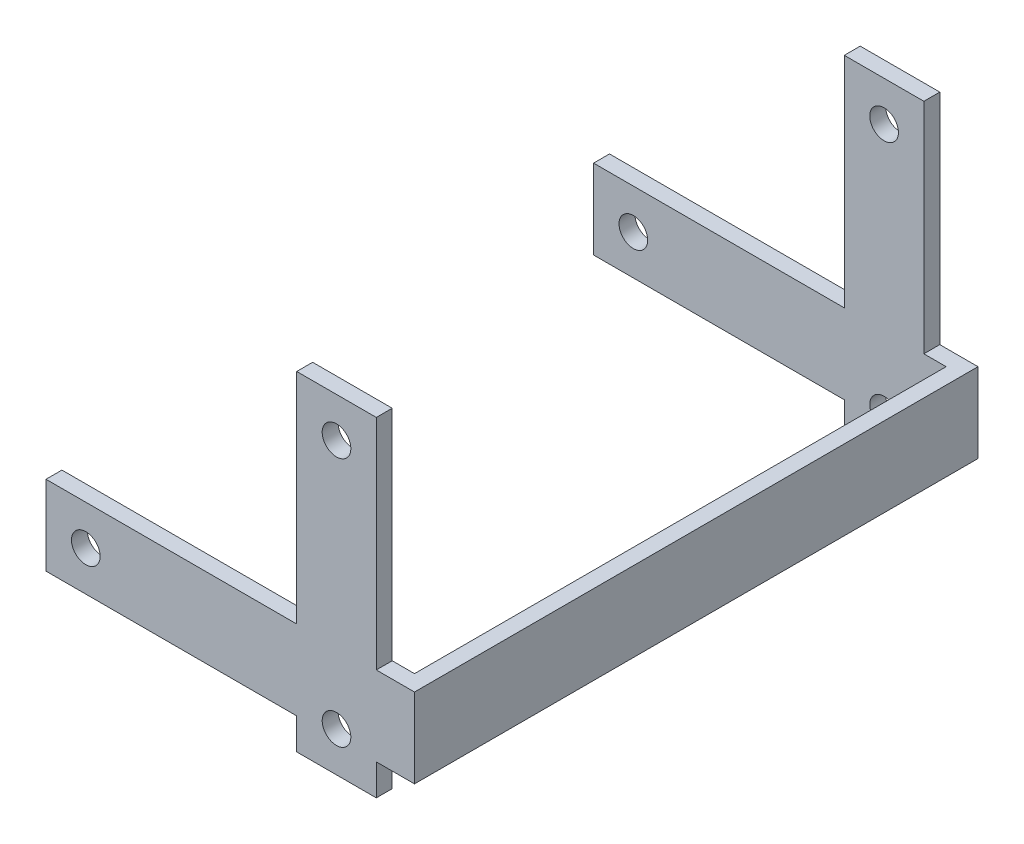
ISO-10303-21;
HEADER;
FILE_DESCRIPTION(('STEP AP214'),'2;1');
FILE_NAME('part.step','',(''),(''),'','','');
FILE_SCHEMA(('AUTOMOTIVE_DESIGN { 1 0 10303 214 1 1 1 1 }'));
ENDSEC;
DATA;
#1=APPLICATION_CONTEXT('core data for automotive mechanical design processes');
#2=APPLICATION_PROTOCOL_DEFINITION('international standard','automotive_design',2000,#1);
#3=PRODUCT_CONTEXT('',#1,'mechanical');
#4=PRODUCT('Part','Part','',(#3));
#5=PRODUCT_RELATED_PRODUCT_CATEGORY('part','',(#4));
#6=PRODUCT_DEFINITION_FORMATION('','',#4);
#7=PRODUCT_DEFINITION_CONTEXT('part definition',#1,'design');
#8=PRODUCT_DEFINITION('design','',#6,#7);
#9=PRODUCT_DEFINITION_SHAPE('','',#8);
#10=(LENGTH_UNIT() NAMED_UNIT(*) SI_UNIT(.MILLI.,.METRE.));
#11=(NAMED_UNIT(*) PLANE_ANGLE_UNIT() SI_UNIT($,.RADIAN.));
#12=(NAMED_UNIT(*) SI_UNIT($,.STERADIAN.) SOLID_ANGLE_UNIT());
#13=UNCERTAINTY_MEASURE_WITH_UNIT(LENGTH_MEASURE(1.E-05),#10,'distance_accuracy_value','');
#14=(GEOMETRIC_REPRESENTATION_CONTEXT(3) GLOBAL_UNCERTAINTY_ASSIGNED_CONTEXT((#13)) GLOBAL_UNIT_ASSIGNED_CONTEXT((#10,
#11,#12)) REPRESENTATION_CONTEXT('',''));
#15=CARTESIAN_POINT('',(0.,0.,0.));
#16=DIRECTION('',(0.,0.,1.));
#17=DIRECTION('',(1.,0.,0.));
#18=AXIS2_PLACEMENT_3D('',#15,#16,#17);
#19=CARTESIAN_POINT('',(0.,0.,0.));
#20=DIRECTION('',(0.,0.,1.));
#21=DIRECTION('',(1.,0.,0.));
#22=AXIS2_PLACEMENT_3D('',#19,#20,#21);
#23=PLANE('',#22);
#24=CARTESIAN_POINT('',(-66.25,-12.5,0.));
#25=DIRECTION('',(0.,0.,1.));
#26=DIRECTION('',(1.,0.,0.));
#27=AXIS2_PLACEMENT_3D('',#24,#25,#26);
#28=CIRCLE('',#27,4.5);
#29=CARTESIAN_POINT('',(-61.75,-12.5,0.));
#30=VERTEX_POINT('',#29);
#31=EDGE_CURVE('E265',#30,#30,#28,.T.);
#32=ORIENTED_EDGE('',*,*,#31,.T.);
#33=EDGE_LOOP('',(#32));
#34=FACE_BOUND('',#33,.T.);
#35=CARTESIAN_POINT('',(12.5,56.2,0.));
#36=DIRECTION('',(0.,0.,1.));
#37=DIRECTION('',(1.,0.,0.));
#38=AXIS2_PLACEMENT_3D('',#35,#36,#37);
#39=CIRCLE('',#38,4.50000000000001);
#40=CARTESIAN_POINT('',(17.,56.2,0.));
#41=VERTEX_POINT('',#40);
#42=EDGE_CURVE('E259',#41,#41,#39,.T.);
#43=ORIENTED_EDGE('',*,*,#42,.T.);
#44=EDGE_LOOP('',(#43));
#45=FACE_BOUND('',#44,.T.);
#46=CARTESIAN_POINT('',(12.5,-22.3,0.));
#47=DIRECTION('',(0.,0.,1.));
#48=DIRECTION('',(1.,0.,0.));
#49=AXIS2_PLACEMENT_3D('',#46,#47,#48);
#50=CIRCLE('',#49,4.5);
#51=CARTESIAN_POINT('',(17.,-22.3,0.));
#52=VERTEX_POINT('',#51);
#53=EDGE_CURVE('E253',#52,#52,#50,.T.);
#54=ORIENTED_EDGE('',*,*,#53,.T.);
#55=EDGE_LOOP('',(#54));
#56=FACE_BOUND('',#55,.T.);
#57=DIRECTION('',(0.,1.,0.));
#58=VECTOR('',#57,1.);
#59=CARTESIAN_POINT('',(32.,0.,0.));
#60=LINE('',#59,#58);
#61=CARTESIAN_POINT('',(32.,-25.,0.));
#62=VERTEX_POINT('',#61);
#63=CARTESIAN_POINT('',(32.,0.,0.));
#64=VERTEX_POINT('',#63);
#65=EDGE_CURVE('E51',#62,#64,#60,.T.);
#66=ORIENTED_EDGE('',*,*,#65,.F.);
#67=DIRECTION('',(1.,0.,0.));
#68=VECTOR('',#67,1.);
#69=CARTESIAN_POINT('',(25.,-25.,0.));
#70=LINE('',#69,#68);
#71=CARTESIAN_POINT('',(25.,-25.,0.));
#72=VERTEX_POINT('',#71);
#73=EDGE_CURVE('E175',#72,#62,#70,.T.);
#74=ORIENTED_EDGE('',*,*,#73,.F.);
#75=DIRECTION('',(0.,1.,0.));
#76=VECTOR('',#75,1.);
#77=CARTESIAN_POINT('',(25.,-34.8,0.));
#78=LINE('',#77,#76);
#79=CARTESIAN_POINT('',(25.,-34.8,0.));
#80=VERTEX_POINT('',#79);
#81=EDGE_CURVE('E173',#80,#72,#78,.T.);
#82=ORIENTED_EDGE('',*,*,#81,.F.);
#83=DIRECTION('',(1.,0.,0.));
#84=VECTOR('',#83,1.);
#85=CARTESIAN_POINT('',(0.,-34.8,0.));
#86=LINE('',#85,#84);
#87=CARTESIAN_POINT('',(0.,-34.8,0.));
#88=VERTEX_POINT('',#87);
#89=EDGE_CURVE('E171',#88,#80,#86,.T.);
#90=ORIENTED_EDGE('',*,*,#89,.F.);
#91=DIRECTION('',(0.,-1.,0.));
#92=VECTOR('',#91,1.);
#93=CARTESIAN_POINT('',(0.,-25.,0.));
#94=LINE('',#93,#92);
#95=CARTESIAN_POINT('',(0.,-25.,0.));
#96=VERTEX_POINT('',#95);
#97=EDGE_CURVE('E169',#96,#88,#94,.T.);
#98=ORIENTED_EDGE('',*,*,#97,.F.);
#99=DIRECTION('',(1.,0.,0.));
#100=VECTOR('',#99,1.);
#101=CARTESIAN_POINT('',(-78.75,-25.,0.));
#102=LINE('',#101,#100);
#103=CARTESIAN_POINT('',(-78.75,-25.,0.));
#104=VERTEX_POINT('',#103);
#105=EDGE_CURVE('E166',#104,#96,#102,.T.);
#106=ORIENTED_EDGE('',*,*,#105,.F.);
#107=DIRECTION('',(0.,-1.,0.));
#108=VECTOR('',#107,1.);
#109=CARTESIAN_POINT('',(-78.75,0.,0.));
#110=LINE('',#109,#108);
#111=CARTESIAN_POINT('',(-78.75,0.,0.));
#112=VERTEX_POINT('',#111);
#113=EDGE_CURVE('E163',#112,#104,#110,.T.);
#114=ORIENTED_EDGE('',*,*,#113,.F.);
#115=DIRECTION('',(-1.,0.,0.));
#116=VECTOR('',#115,1.);
#117=CARTESIAN_POINT('',(0.,0.,0.));
#118=LINE('',#117,#116);
#119=CARTESIAN_POINT('',(0.,0.,0.));
#120=VERTEX_POINT('',#119);
#121=EDGE_CURVE('E99',#120,#112,#118,.T.);
#122=ORIENTED_EDGE('',*,*,#121,.F.);
#123=DIRECTION('',(0.,-1.,0.));
#124=VECTOR('',#123,1.);
#125=CARTESIAN_POINT('',(0.,68.7,0.));
#126=LINE('',#125,#124);
#127=CARTESIAN_POINT('',(0.,68.7,0.));
#128=VERTEX_POINT('',#127);
#129=EDGE_CURVE('E182',#128,#120,#126,.T.);
#130=ORIENTED_EDGE('',*,*,#129,.F.);
#131=DIRECTION('',(-1.,0.,0.));
#132=VECTOR('',#131,1.);
#133=CARTESIAN_POINT('',(25.,68.7,0.));
#134=LINE('',#133,#132);
#135=CARTESIAN_POINT('',(25.,68.7,0.));
#136=VERTEX_POINT('',#135);
#137=EDGE_CURVE('E151',#136,#128,#134,.T.);
#138=ORIENTED_EDGE('',*,*,#137,.F.);
#139=DIRECTION('',(0.,1.,0.));
#140=VECTOR('',#139,1.);
#141=CARTESIAN_POINT('',(25.,0.,0.));
#142=LINE('',#141,#140);
#143=CARTESIAN_POINT('',(25.,0.,0.));
#144=VERTEX_POINT('',#143);
#145=EDGE_CURVE('E179',#144,#136,#142,.T.);
#146=ORIENTED_EDGE('',*,*,#145,.F.);
#147=DIRECTION('',(-1.,0.,0.));
#148=VECTOR('',#147,1.);
#149=CARTESIAN_POINT('',(37.,0.,0.));
#150=LINE('',#149,#148);
#151=EDGE_CURVE('E177',#64,#144,#150,.T.);
#152=ORIENTED_EDGE('',*,*,#151,.F.);
#153=EDGE_LOOP('',(#66,#74,#82,#90,#98,#106,#114,#122,#130,#138,#146,#152));
#154=FACE_BOUND('',#153,.T.);
#155=ADVANCED_FACE('F36',(#34,#45,#56,#154),#23,.F.);
#156=CARTESIAN_POINT('',(0.,0.,5.));
#157=DIRECTION('',(0.,0.,1.));
#158=DIRECTION('',(1.,0.,0.));
#159=AXIS2_PLACEMENT_3D('',#156,#157,#158);
#160=PLANE('',#159);
#161=CARTESIAN_POINT('',(12.5,56.2,5.));
#162=DIRECTION('',(0.,0.,1.));
#163=DIRECTION('',(1.,0.,0.));
#164=AXIS2_PLACEMENT_3D('',#161,#162,#163);
#165=CIRCLE('',#164,4.50000000000001);
#166=CARTESIAN_POINT('',(17.,56.2,5.));
#167=VERTEX_POINT('',#166);
#168=EDGE_CURVE('E256',#167,#167,#165,.T.);
#169=ORIENTED_EDGE('',*,*,#168,.F.);
#170=EDGE_LOOP('',(#169));
#171=FACE_BOUND('',#170,.T.);
#172=DIRECTION('',(0.,-1.,0.));
#173=VECTOR('',#172,1.);
#174=CARTESIAN_POINT('',(-78.75,0.,5.));
#175=LINE('',#174,#173);
#176=CARTESIAN_POINT('',(-78.75,0.,5.));
#177=VERTEX_POINT('',#176);
#178=CARTESIAN_POINT('',(-78.75,-25.,5.));
#179=VERTEX_POINT('',#178);
#180=EDGE_CURVE('E185',#177,#179,#175,.T.);
#181=ORIENTED_EDGE('',*,*,#180,.T.);
#182=DIRECTION('',(1.,0.,0.));
#183=VECTOR('',#182,1.);
#184=CARTESIAN_POINT('',(-78.75,-25.,5.));
#185=LINE('',#184,#183);
#186=CARTESIAN_POINT('',(0.,-25.,5.));
#187=VERTEX_POINT('',#186);
#188=EDGE_CURVE('E107',#179,#187,#185,.T.);
#189=ORIENTED_EDGE('',*,*,#188,.T.);
#190=DIRECTION('',(0.,-1.,0.));
#191=VECTOR('',#190,1.);
#192=CARTESIAN_POINT('',(0.,-25.,5.));
#193=LINE('',#192,#191);
#194=CARTESIAN_POINT('',(0.,-34.8,5.));
#195=VERTEX_POINT('',#194);
#196=EDGE_CURVE('E212',#187,#195,#193,.T.);
#197=ORIENTED_EDGE('',*,*,#196,.T.);
#198=DIRECTION('',(1.,0.,0.));
#199=VECTOR('',#198,1.);
#200=CARTESIAN_POINT('',(0.,-34.8,5.));
#201=LINE('',#200,#199);
#202=CARTESIAN_POINT('',(25.,-34.8,5.));
#203=VERTEX_POINT('',#202);
#204=EDGE_CURVE('E227',#195,#203,#201,.T.);
#205=ORIENTED_EDGE('',*,*,#204,.T.);
#206=DIRECTION('',(0.,1.,0.));
#207=VECTOR('',#206,1.);
#208=CARTESIAN_POINT('',(25.,-34.8,5.));
#209=LINE('',#208,#207);
#210=CARTESIAN_POINT('',(25.,-25.,5.));
#211=VERTEX_POINT('',#210);
#212=EDGE_CURVE('E224',#203,#211,#209,.T.);
#213=ORIENTED_EDGE('',*,*,#212,.T.);
#214=DIRECTION('',(1.,0.,0.));
#215=VECTOR('',#214,1.);
#216=CARTESIAN_POINT('',(25.,-25.,5.));
#217=LINE('',#216,#215);
#218=CARTESIAN_POINT('',(37.,-25.,5.));
#219=VERTEX_POINT('',#218);
#220=EDGE_CURVE('E226',#211,#219,#217,.T.);
#221=ORIENTED_EDGE('',*,*,#220,.T.);
#222=DIRECTION('',(0.,1.,0.));
#223=VECTOR('',#222,1.);
#224=CARTESIAN_POINT('',(37.,-25.,5.));
#225=LINE('',#224,#223);
#226=CARTESIAN_POINT('',(37.,0.,5.));
#227=VERTEX_POINT('',#226);
#228=EDGE_CURVE('E229',#219,#227,#225,.T.);
#229=ORIENTED_EDGE('',*,*,#228,.T.);
#230=DIRECTION('',(-1.,0.,0.));
#231=VECTOR('',#230,1.);
#232=CARTESIAN_POINT('',(37.,0.,5.));
#233=LINE('',#232,#231);
#234=CARTESIAN_POINT('',(25.,0.,5.));
#235=VERTEX_POINT('',#234);
#236=EDGE_CURVE('E235',#227,#235,#233,.T.);
#237=ORIENTED_EDGE('',*,*,#236,.T.);
#238=DIRECTION('',(0.,1.,0.));
#239=VECTOR('',#238,1.);
#240=CARTESIAN_POINT('',(25.,0.,5.));
#241=LINE('',#240,#239);
#242=CARTESIAN_POINT('',(25.,68.7,5.));
#243=VERTEX_POINT('',#242);
#244=EDGE_CURVE('E142',#235,#243,#241,.T.);
#245=ORIENTED_EDGE('',*,*,#244,.T.);
#246=DIRECTION('',(-1.,0.,0.));
#247=VECTOR('',#246,1.);
#248=CARTESIAN_POINT('',(25.,68.7,5.));
#249=LINE('',#248,#247);
#250=CARTESIAN_POINT('',(0.,68.7,5.));
#251=VERTEX_POINT('',#250);
#252=EDGE_CURVE('E134',#243,#251,#249,.T.);
#253=ORIENTED_EDGE('',*,*,#252,.T.);
#254=DIRECTION('',(0.,-1.,0.));
#255=VECTOR('',#254,1.);
#256=CARTESIAN_POINT('',(0.,68.7,5.));
#257=LINE('',#256,#255);
#258=CARTESIAN_POINT('',(0.,0.,5.));
#259=VERTEX_POINT('',#258);
#260=EDGE_CURVE('E139',#251,#259,#257,.T.);
#261=ORIENTED_EDGE('',*,*,#260,.T.);
#262=DIRECTION('',(-1.,0.,0.));
#263=VECTOR('',#262,1.);
#264=CARTESIAN_POINT('',(0.,0.,5.));
#265=LINE('',#264,#263);
#266=EDGE_CURVE('E60',#259,#177,#265,.T.);
#267=ORIENTED_EDGE('',*,*,#266,.T.);
#268=EDGE_LOOP('',(#181,#189,#197,#205,#213,#221,#229,#237,#245,#253,#261,#267));
#269=FACE_BOUND('',#268,.T.);
#270=CARTESIAN_POINT('',(12.5,-22.3,5.));
#271=DIRECTION('',(0.,0.,1.));
#272=DIRECTION('',(1.,0.,0.));
#273=AXIS2_PLACEMENT_3D('',#270,#271,#272);
#274=CIRCLE('',#273,4.5);
#275=CARTESIAN_POINT('',(17.,-22.3,5.));
#276=VERTEX_POINT('',#275);
#277=EDGE_CURVE('E167',#276,#276,#274,.T.);
#278=ORIENTED_EDGE('',*,*,#277,.F.);
#279=EDGE_LOOP('',(#278));
#280=FACE_BOUND('',#279,.T.);
#281=CARTESIAN_POINT('',(-66.25,-12.5,5.));
#282=DIRECTION('',(0.,0.,1.));
#283=DIRECTION('',(1.,0.,0.));
#284=AXIS2_PLACEMENT_3D('',#281,#282,#283);
#285=CIRCLE('',#284,4.5);
#286=CARTESIAN_POINT('',(-61.75,-12.5,5.));
#287=VERTEX_POINT('',#286);
#288=EDGE_CURVE('E262',#287,#287,#285,.T.);
#289=ORIENTED_EDGE('',*,*,#288,.F.);
#290=EDGE_LOOP('',(#289));
#291=FACE_BOUND('',#290,.T.);
#292=ADVANCED_FACE('F136',(#171,#269,#280,#291),#160,.T.);
#293=CARTESIAN_POINT('',(-78.75,0.,5.));
#294=DIRECTION('',(1.,0.,0.));
#295=DIRECTION('',(0.,0.,-1.));
#296=AXIS2_PLACEMENT_3D('',#293,#294,#295);
#297=PLANE('',#296);
#298=ORIENTED_EDGE('',*,*,#113,.T.);
#299=DIRECTION('',(0.,0.,-1.));
#300=VECTOR('',#299,1.);
#301=CARTESIAN_POINT('',(-78.75,-25.,5.));
#302=LINE('',#301,#300);
#303=EDGE_CURVE('E11',#179,#104,#302,.T.);
#304=ORIENTED_EDGE('',*,*,#303,.F.);
#305=ORIENTED_EDGE('',*,*,#180,.F.);
#306=DIRECTION('',(0.,0.,-1.));
#307=VECTOR('',#306,1.);
#308=CARTESIAN_POINT('',(-78.75,0.,5.));
#309=LINE('',#308,#307);
#310=EDGE_CURVE('E159',#177,#112,#309,.T.);
#311=ORIENTED_EDGE('',*,*,#310,.T.);
#312=EDGE_LOOP('',(#298,#304,#305,#311));
#313=FACE_BOUND('',#312,.T.);
#314=ADVANCED_FACE('F38',(#313),#297,.F.);
#315=CARTESIAN_POINT('',(-78.75,-25.,5.));
#316=DIRECTION('',(0.,1.,0.));
#317=DIRECTION('',(0.,0.,1.));
#318=AXIS2_PLACEMENT_3D('',#315,#316,#317);
#319=PLANE('',#318);
#320=ORIENTED_EDGE('',*,*,#105,.T.);
#321=DIRECTION('',(0.,0.,-1.));
#322=VECTOR('',#321,1.);
#323=CARTESIAN_POINT('',(0.,-25.,5.));
#324=LINE('',#323,#322);
#325=EDGE_CURVE('E44',#187,#96,#324,.T.);
#326=ORIENTED_EDGE('',*,*,#325,.F.);
#327=ORIENTED_EDGE('',*,*,#188,.F.);
#328=ORIENTED_EDGE('',*,*,#303,.T.);
#329=EDGE_LOOP('',(#320,#326,#327,#328));
#330=FACE_BOUND('',#329,.T.);
#331=ADVANCED_FACE('F547',(#330),#319,.F.);
#332=CARTESIAN_POINT('',(0.,-25.,5.));
#333=DIRECTION('',(1.,0.,0.));
#334=DIRECTION('',(0.,1.,0.));
#335=AXIS2_PLACEMENT_3D('',#332,#333,#334);
#336=PLANE('',#335);
#337=ORIENTED_EDGE('',*,*,#97,.T.);
#338=DIRECTION('',(0.,0.,-1.));
#339=VECTOR('',#338,1.);
#340=CARTESIAN_POINT('',(0.,-34.8,5.));
#341=LINE('',#340,#339);
#342=EDGE_CURVE('E204',#195,#88,#341,.T.);
#343=ORIENTED_EDGE('',*,*,#342,.F.);
#344=ORIENTED_EDGE('',*,*,#196,.F.);
#345=ORIENTED_EDGE('',*,*,#325,.T.);
#346=EDGE_LOOP('',(#337,#343,#344,#345));
#347=FACE_BOUND('',#346,.T.);
#348=ADVANCED_FACE('F210',(#347),#336,.F.);
#349=CARTESIAN_POINT('',(0.,-34.8,5.));
#350=DIRECTION('',(0.,1.,0.));
#351=DIRECTION('',(0.,0.,1.));
#352=AXIS2_PLACEMENT_3D('',#349,#350,#351);
#353=PLANE('',#352);
#354=ORIENTED_EDGE('',*,*,#89,.T.);
#355=DIRECTION('',(0.,0.,-1.));
#356=VECTOR('',#355,1.);
#357=CARTESIAN_POINT('',(25.,-34.8,5.));
#358=LINE('',#357,#356);
#359=EDGE_CURVE('E201',#203,#80,#358,.T.);
#360=ORIENTED_EDGE('',*,*,#359,.F.);
#361=ORIENTED_EDGE('',*,*,#204,.F.);
#362=ORIENTED_EDGE('',*,*,#342,.T.);
#363=EDGE_LOOP('',(#354,#360,#361,#362));
#364=FACE_BOUND('',#363,.T.);
#365=ADVANCED_FACE('F218',(#364),#353,.F.);
#366=CARTESIAN_POINT('',(25.,-34.8,5.));
#367=DIRECTION('',(-1.,0.,0.));
#368=DIRECTION('',(0.,-1.,0.));
#369=AXIS2_PLACEMENT_3D('',#366,#367,#368);
#370=PLANE('',#369);
#371=ORIENTED_EDGE('',*,*,#81,.T.);
#372=DIRECTION('',(0.,0.,-1.));
#373=VECTOR('',#372,1.);
#374=CARTESIAN_POINT('',(25.,-25.,5.));
#375=LINE('',#374,#373);
#376=EDGE_CURVE('E198',#211,#72,#375,.T.);
#377=ORIENTED_EDGE('',*,*,#376,.F.);
#378=ORIENTED_EDGE('',*,*,#212,.F.);
#379=ORIENTED_EDGE('',*,*,#359,.T.);
#380=EDGE_LOOP('',(#371,#377,#378,#379));
#381=FACE_BOUND('',#380,.T.);
#382=ADVANCED_FACE('F222',(#381),#370,.F.);
#383=CARTESIAN_POINT('',(25.,-25.,5.));
#384=DIRECTION('',(0.,1.,0.));
#385=DIRECTION('',(0.,0.,1.));
#386=AXIS2_PLACEMENT_3D('',#383,#384,#385);
#387=PLANE('',#386);
#388=ORIENTED_EDGE('',*,*,#73,.T.);
#389=DIRECTION('',(0.,0.,1.));
#390=VECTOR('',#389,1.);
#391=CARTESIAN_POINT('',(32.,-25.,-83.5));
#392=LINE('',#391,#390);
#393=CARTESIAN_POINT('',(32.,-25.,-167.));
#394=VERTEX_POINT('',#393);
#395=EDGE_CURVE('E268',#394,#62,#392,.T.);
#396=ORIENTED_EDGE('',*,*,#395,.F.);
#397=DIRECTION('',(1.,0.,0.));
#398=VECTOR('',#397,1.);
#399=CARTESIAN_POINT('',(25.,-25.,-167.));
#400=LINE('',#399,#398);
#401=CARTESIAN_POINT('',(25.,-25.,-167.));
#402=VERTEX_POINT('',#401);
#403=EDGE_CURVE('E323',#402,#394,#400,.T.);
#404=ORIENTED_EDGE('',*,*,#403,.F.);
#405=DIRECTION('',(0.,0.,1.));
#406=VECTOR('',#405,1.);
#407=CARTESIAN_POINT('',(25.,-25.,-172.));
#408=LINE('',#407,#406);
#409=CARTESIAN_POINT('',(25.,-25.,-172.));
#410=VERTEX_POINT('',#409);
#411=EDGE_CURVE('E288',#410,#402,#408,.T.);
#412=ORIENTED_EDGE('',*,*,#411,.F.);
#413=DIRECTION('',(1.,0.,0.));
#414=VECTOR('',#413,1.);
#415=CARTESIAN_POINT('',(25.,-25.,-172.));
#416=LINE('',#415,#414);
#417=CARTESIAN_POINT('',(37.,-25.,-172.));
#418=VERTEX_POINT('',#417);
#419=EDGE_CURVE('E359',#410,#418,#416,.T.);
#420=ORIENTED_EDGE('',*,*,#419,.T.);
#421=DIRECTION('',(0.,0.,-1.));
#422=VECTOR('',#421,1.);
#423=CARTESIAN_POINT('',(37.,-25.,5.));
#424=LINE('',#423,#422);
#425=EDGE_CURVE('E195',#219,#418,#424,.T.);
#426=ORIENTED_EDGE('',*,*,#425,.F.);
#427=ORIENTED_EDGE('',*,*,#220,.F.);
#428=ORIENTED_EDGE('',*,*,#376,.T.);
#429=EDGE_LOOP('',(#388,#396,#404,#412,#420,#426,#427,#428));
#430=FACE_BOUND('',#429,.T.);
#431=ADVANCED_FACE('F497',(#430),#387,.F.);
#432=CARTESIAN_POINT('',(37.,-25.,5.));
#433=DIRECTION('',(-1.,0.,0.));
#434=DIRECTION('',(0.,-1.,0.));
#435=AXIS2_PLACEMENT_3D('',#432,#433,#434);
#436=PLANE('',#435);
#437=ORIENTED_EDGE('',*,*,#425,.T.);
#438=DIRECTION('',(0.,1.,0.));
#439=VECTOR('',#438,1.);
#440=CARTESIAN_POINT('',(37.,-25.,-172.));
#441=LINE('',#440,#439);
#442=CARTESIAN_POINT('',(37.,0.,-172.));
#443=VERTEX_POINT('',#442);
#444=EDGE_CURVE('E356',#418,#443,#441,.T.);
#445=ORIENTED_EDGE('',*,*,#444,.T.);
#446=DIRECTION('',(0.,0.,-1.));
#447=VECTOR('',#446,1.);
#448=CARTESIAN_POINT('',(37.,0.,5.));
#449=LINE('',#448,#447);
#450=EDGE_CURVE('E192',#227,#443,#449,.T.);
#451=ORIENTED_EDGE('',*,*,#450,.F.);
#452=ORIENTED_EDGE('',*,*,#228,.F.);
#453=EDGE_LOOP('',(#437,#445,#451,#452));
#454=FACE_BOUND('',#453,.T.);
#455=ADVANCED_FACE('F495',(#454),#436,.F.);
#456=CARTESIAN_POINT('',(37.,0.,5.));
#457=DIRECTION('',(0.,-1.,0.));
#458=DIRECTION('',(1.,0.,0.));
#459=AXIS2_PLACEMENT_3D('',#456,#457,#458);
#460=PLANE('',#459);
#461=ORIENTED_EDGE('',*,*,#450,.T.);
#462=DIRECTION('',(-1.,0.,0.));
#463=VECTOR('',#462,1.);
#464=CARTESIAN_POINT('',(37.,0.,-172.));
#465=LINE('',#464,#463);
#466=CARTESIAN_POINT('',(25.,0.,-172.));
#467=VERTEX_POINT('',#466);
#468=EDGE_CURVE('E353',#443,#467,#465,.T.);
#469=ORIENTED_EDGE('',*,*,#468,.T.);
#470=DIRECTION('',(0.,0.,1.));
#471=VECTOR('',#470,1.);
#472=CARTESIAN_POINT('',(25.,0.,-172.));
#473=LINE('',#472,#471);
#474=CARTESIAN_POINT('',(25.,0.,-167.));
#475=VERTEX_POINT('',#474);
#476=EDGE_CURVE('E291',#467,#475,#473,.T.);
#477=ORIENTED_EDGE('',*,*,#476,.T.);
#478=DIRECTION('',(-1.,0.,0.));
#479=VECTOR('',#478,1.);
#480=CARTESIAN_POINT('',(37.,0.,-167.));
#481=LINE('',#480,#479);
#482=CARTESIAN_POINT('',(32.,0.,-167.));
#483=VERTEX_POINT('',#482);
#484=EDGE_CURVE('E320',#483,#475,#481,.T.);
#485=ORIENTED_EDGE('',*,*,#484,.F.);
#486=DIRECTION('',(0.,0.,1.));
#487=VECTOR('',#486,1.);
#488=CARTESIAN_POINT('',(32.,0.,-83.5));
#489=LINE('',#488,#487);
#490=EDGE_CURVE('E273',#483,#64,#489,.T.);
#491=ORIENTED_EDGE('',*,*,#490,.T.);
#492=ORIENTED_EDGE('',*,*,#151,.T.);
#493=DIRECTION('',(0.,0.,-1.));
#494=VECTOR('',#493,1.);
#495=CARTESIAN_POINT('',(25.,0.,5.));
#496=LINE('',#495,#494);
#497=EDGE_CURVE('E189',#235,#144,#496,.T.);
#498=ORIENTED_EDGE('',*,*,#497,.F.);
#499=ORIENTED_EDGE('',*,*,#236,.F.);
#500=EDGE_LOOP('',(#461,#469,#477,#485,#491,#492,#498,#499));
#501=FACE_BOUND('',#500,.T.);
#502=ADVANCED_FACE('F241',(#501),#460,.F.);
#503=CARTESIAN_POINT('',(25.,0.,5.));
#504=DIRECTION('',(-1.,0.,0.));
#505=DIRECTION('',(0.,-1.,0.));
#506=AXIS2_PLACEMENT_3D('',#503,#504,#505);
#507=PLANE('',#506);
#508=ORIENTED_EDGE('',*,*,#145,.T.);
#509=DIRECTION('',(0.,0.,-1.));
#510=VECTOR('',#509,1.);
#511=CARTESIAN_POINT('',(25.,68.7,5.));
#512=LINE('',#511,#510);
#513=EDGE_CURVE('E154',#243,#136,#512,.T.);
#514=ORIENTED_EDGE('',*,*,#513,.F.);
#515=ORIENTED_EDGE('',*,*,#244,.F.);
#516=ORIENTED_EDGE('',*,*,#497,.T.);
#517=EDGE_LOOP('',(#508,#514,#515,#516));
#518=FACE_BOUND('',#517,.T.);
#519=ADVANCED_FACE('F245',(#518),#507,.F.);
#520=CARTESIAN_POINT('',(25.,68.7,5.));
#521=DIRECTION('',(0.,-1.,0.));
#522=DIRECTION('',(1.,0.,0.));
#523=AXIS2_PLACEMENT_3D('',#520,#521,#522);
#524=PLANE('',#523);
#525=ORIENTED_EDGE('',*,*,#137,.T.);
#526=DIRECTION('',(0.,0.,-1.));
#527=VECTOR('',#526,1.);
#528=CARTESIAN_POINT('',(0.,68.7,5.));
#529=LINE('',#528,#527);
#530=EDGE_CURVE('E148',#251,#128,#529,.T.);
#531=ORIENTED_EDGE('',*,*,#530,.F.);
#532=ORIENTED_EDGE('',*,*,#252,.F.);
#533=ORIENTED_EDGE('',*,*,#513,.T.);
#534=EDGE_LOOP('',(#525,#531,#532,#533));
#535=FACE_BOUND('',#534,.T.);
#536=ADVANCED_FACE('F149',(#535),#524,.F.);
#537=CARTESIAN_POINT('',(0.,68.7,5.));
#538=DIRECTION('',(1.,0.,0.));
#539=DIRECTION('',(0.,1.,0.));
#540=AXIS2_PLACEMENT_3D('',#537,#538,#539);
#541=PLANE('',#540);
#542=ORIENTED_EDGE('',*,*,#129,.T.);
#543=DIRECTION('',(0.,0.,-1.));
#544=VECTOR('',#543,1.);
#545=CARTESIAN_POINT('',(0.,0.,5.));
#546=LINE('',#545,#544);
#547=EDGE_CURVE('E155',#259,#120,#546,.T.);
#548=ORIENTED_EDGE('',*,*,#547,.F.);
#549=ORIENTED_EDGE('',*,*,#260,.F.);
#550=ORIENTED_EDGE('',*,*,#530,.T.);
#551=EDGE_LOOP('',(#542,#548,#549,#550));
#552=FACE_BOUND('',#551,.T.);
#553=ADVANCED_FACE('F157',(#552),#541,.F.);
#554=CARTESIAN_POINT('',(0.,0.,5.));
#555=DIRECTION('',(0.,-1.,0.));
#556=DIRECTION('',(1.,0.,0.));
#557=AXIS2_PLACEMENT_3D('',#554,#555,#556);
#558=PLANE('',#557);
#559=ORIENTED_EDGE('',*,*,#121,.T.);
#560=ORIENTED_EDGE('',*,*,#310,.F.);
#561=ORIENTED_EDGE('',*,*,#266,.F.);
#562=ORIENTED_EDGE('',*,*,#547,.T.);
#563=EDGE_LOOP('',(#559,#560,#561,#562));
#564=FACE_BOUND('',#563,.T.);
#565=ADVANCED_FACE('F246',(#564),#558,.F.);
#566=CARTESIAN_POINT('',(12.5,-22.3,5.));
#567=DIRECTION('',(0.,0.,-1.));
#568=DIRECTION('',(-1.,0.,0.));
#569=AXIS2_PLACEMENT_3D('',#566,#567,#568);
#570=CYLINDRICAL_SURFACE('',#569,4.5);
#571=ORIENTED_EDGE('',*,*,#277,.T.);
#572=EDGE_LOOP('',(#571));
#573=FACE_BOUND('',#572,.T.);
#574=ORIENTED_EDGE('',*,*,#53,.F.);
#575=EDGE_LOOP('',(#574));
#576=FACE_BOUND('',#575,.T.);
#577=ADVANCED_FACE('F529',(#573,#576),#570,.F.);
#578=CARTESIAN_POINT('',(12.5,56.2,5.));
#579=DIRECTION('',(0.,0.,-1.));
#580=DIRECTION('',(-1.,0.,0.));
#581=AXIS2_PLACEMENT_3D('',#578,#579,#580);
#582=CYLINDRICAL_SURFACE('',#581,4.50000000000001);
#583=ORIENTED_EDGE('',*,*,#168,.T.);
#584=EDGE_LOOP('',(#583));
#585=FACE_BOUND('',#584,.T.);
#586=ORIENTED_EDGE('',*,*,#42,.F.);
#587=EDGE_LOOP('',(#586));
#588=FACE_BOUND('',#587,.T.);
#589=ADVANCED_FACE('F650',(#585,#588),#582,.F.);
#590=CARTESIAN_POINT('',(-66.25,-12.5,5.));
#591=DIRECTION('',(0.,0.,-1.));
#592=DIRECTION('',(-1.,0.,0.));
#593=AXIS2_PLACEMENT_3D('',#590,#591,#592);
#594=CYLINDRICAL_SURFACE('',#593,4.5);
#595=ORIENTED_EDGE('',*,*,#288,.T.);
#596=EDGE_LOOP('',(#595));
#597=FACE_BOUND('',#596,.T.);
#598=ORIENTED_EDGE('',*,*,#31,.F.);
#599=EDGE_LOOP('',(#598));
#600=FACE_BOUND('',#599,.T.);
#601=ADVANCED_FACE('F657',(#597,#600),#594,.F.);
#602=CARTESIAN_POINT('',(32.,0.,-83.5));
#603=DIRECTION('',(1.,0.,0.));
#604=DIRECTION('',(0.,1.,0.));
#605=AXIS2_PLACEMENT_3D('',#602,#603,#604);
#606=PLANE('',#605);
#607=ORIENTED_EDGE('',*,*,#65,.T.);
#608=ORIENTED_EDGE('',*,*,#490,.F.);
#609=DIRECTION('',(0.,1.,0.));
#610=VECTOR('',#609,1.);
#611=CARTESIAN_POINT('',(32.,0.,-167.));
#612=LINE('',#611,#610);
#613=EDGE_CURVE('E391',#394,#483,#612,.T.);
#614=ORIENTED_EDGE('',*,*,#613,.F.);
#615=ORIENTED_EDGE('',*,*,#395,.T.);
#616=EDGE_LOOP('',(#607,#608,#614,#615));
#617=FACE_BOUND('',#616,.T.);
#618=ADVANCED_FACE('F407',(#617),#606,.F.);
#619=CARTESIAN_POINT('',(0.,0.,-167.));
#620=DIRECTION('',(0.,0.,-1.));
#621=DIRECTION('',(1.,0.,0.));
#622=AXIS2_PLACEMENT_3D('',#619,#620,#621);
#623=PLANE('',#622);
#624=CARTESIAN_POINT('',(-66.25,-12.5,-167.));
#625=DIRECTION('',(0.,0.,1.));
#626=DIRECTION('',(1.,0.,0.));
#627=AXIS2_PLACEMENT_3D('',#624,#625,#626);
#628=CIRCLE('',#627,4.5);
#629=CARTESIAN_POINT('',(-61.75,-12.5,-167.));
#630=VERTEX_POINT('',#629);
#631=EDGE_CURVE('E388',#630,#630,#628,.T.);
#632=ORIENTED_EDGE('',*,*,#631,.F.);
#633=EDGE_LOOP('',(#632));
#634=FACE_BOUND('',#633,.T.);
#635=CARTESIAN_POINT('',(12.5,56.2,-167.));
#636=DIRECTION('',(0.,0.,1.));
#637=DIRECTION('',(1.,0.,0.));
#638=AXIS2_PLACEMENT_3D('',#635,#636,#637);
#639=CIRCLE('',#638,4.50000000000001);
#640=CARTESIAN_POINT('',(17.,56.2,-167.));
#641=VERTEX_POINT('',#640);
#642=EDGE_CURVE('E382',#641,#641,#639,.T.);
#643=ORIENTED_EDGE('',*,*,#642,.F.);
#644=EDGE_LOOP('',(#643));
#645=FACE_BOUND('',#644,.T.);
#646=CARTESIAN_POINT('',(12.5,-22.3,-167.));
#647=DIRECTION('',(0.,0.,1.));
#648=DIRECTION('',(1.,0.,0.));
#649=AXIS2_PLACEMENT_3D('',#646,#647,#648);
#650=CIRCLE('',#649,4.5);
#651=CARTESIAN_POINT('',(17.,-22.3,-167.));
#652=VERTEX_POINT('',#651);
#653=EDGE_CURVE('E376',#652,#652,#650,.T.);
#654=ORIENTED_EDGE('',*,*,#653,.F.);
#655=EDGE_LOOP('',(#654));
#656=FACE_BOUND('',#655,.T.);
#657=ORIENTED_EDGE('',*,*,#613,.T.);
#658=ORIENTED_EDGE('',*,*,#484,.T.);
#659=DIRECTION('',(0.,1.,0.));
#660=VECTOR('',#659,1.);
#661=CARTESIAN_POINT('',(25.,0.,-167.));
#662=LINE('',#661,#660);
#663=CARTESIAN_POINT('',(25.,68.7,-167.));
#664=VERTEX_POINT('',#663);
#665=EDGE_CURVE('E317',#475,#664,#662,.T.);
#666=ORIENTED_EDGE('',*,*,#665,.T.);
#667=DIRECTION('',(-1.,0.,0.));
#668=VECTOR('',#667,1.);
#669=CARTESIAN_POINT('',(25.,68.7,-167.));
#670=LINE('',#669,#668);
#671=CARTESIAN_POINT('',(0.,68.7,-167.));
#672=VERTEX_POINT('',#671);
#673=EDGE_CURVE('E314',#664,#672,#670,.T.);
#674=ORIENTED_EDGE('',*,*,#673,.T.);
#675=DIRECTION('',(0.,-1.,0.));
#676=VECTOR('',#675,1.);
#677=CARTESIAN_POINT('',(0.,68.7,-167.));
#678=LINE('',#677,#676);
#679=CARTESIAN_POINT('',(0.,0.,-167.));
#680=VERTEX_POINT('',#679);
#681=EDGE_CURVE('E311',#672,#680,#678,.T.);
#682=ORIENTED_EDGE('',*,*,#681,.T.);
#683=DIRECTION('',(-1.,0.,0.));
#684=VECTOR('',#683,1.);
#685=CARTESIAN_POINT('',(0.,0.,-167.));
#686=LINE('',#685,#684);
#687=CARTESIAN_POINT('',(-78.75,0.,-167.));
#688=VERTEX_POINT('',#687);
#689=EDGE_CURVE('E307',#680,#688,#686,.T.);
#690=ORIENTED_EDGE('',*,*,#689,.T.);
#691=DIRECTION('',(0.,-1.,0.));
#692=VECTOR('',#691,1.);
#693=CARTESIAN_POINT('',(-78.75,0.,-167.));
#694=LINE('',#693,#692);
#695=CARTESIAN_POINT('',(-78.75,-25.,-167.));
#696=VERTEX_POINT('',#695);
#697=EDGE_CURVE('E338',#688,#696,#694,.T.);
#698=ORIENTED_EDGE('',*,*,#697,.T.);
#699=DIRECTION('',(1.,0.,0.));
#700=VECTOR('',#699,1.);
#701=CARTESIAN_POINT('',(-78.75,-25.,-167.));
#702=LINE('',#701,#700);
#703=CARTESIAN_POINT('',(0.,-25.,-167.));
#704=VERTEX_POINT('',#703);
#705=EDGE_CURVE('E335',#696,#704,#702,.T.);
#706=ORIENTED_EDGE('',*,*,#705,.T.);
#707=DIRECTION('',(0.,-1.,0.));
#708=VECTOR('',#707,1.);
#709=CARTESIAN_POINT('',(0.,-25.,-167.));
#710=LINE('',#709,#708);
#711=CARTESIAN_POINT('',(0.,-34.8,-167.));
#712=VERTEX_POINT('',#711);
#713=EDGE_CURVE('E332',#704,#712,#710,.T.);
#714=ORIENTED_EDGE('',*,*,#713,.T.);
#715=DIRECTION('',(1.,0.,0.));
#716=VECTOR('',#715,1.);
#717=CARTESIAN_POINT('',(0.,-34.8,-167.));
#718=LINE('',#717,#716);
#719=CARTESIAN_POINT('',(25.,-34.8,-167.));
#720=VERTEX_POINT('',#719);
#721=EDGE_CURVE('E329',#712,#720,#718,.T.);
#722=ORIENTED_EDGE('',*,*,#721,.T.);
#723=DIRECTION('',(0.,1.,0.));
#724=VECTOR('',#723,1.);
#725=CARTESIAN_POINT('',(25.,-34.8,-167.));
#726=LINE('',#725,#724);
#727=EDGE_CURVE('E326',#720,#402,#726,.T.);
#728=ORIENTED_EDGE('',*,*,#727,.T.);
#729=ORIENTED_EDGE('',*,*,#403,.T.);
#730=EDGE_LOOP('',(#657,#658,#666,#674,#682,#690,#698,#706,#714,#722,#728,#729));
#731=FACE_BOUND('',#730,.T.);
#732=ADVANCED_FACE('F398',(#634,#645,#656,#731),#623,.F.);
#733=CARTESIAN_POINT('',(0.,0.,-172.));
#734=DIRECTION('',(0.,0.,-1.));
#735=DIRECTION('',(1.,0.,0.));
#736=AXIS2_PLACEMENT_3D('',#733,#734,#735);
#737=PLANE('',#736);
#738=CARTESIAN_POINT('',(12.5,56.2,-172.));
#739=DIRECTION('',(0.,0.,1.));
#740=DIRECTION('',(1.,0.,0.));
#741=AXIS2_PLACEMENT_3D('',#738,#739,#740);
#742=CIRCLE('',#741,4.50000000000001);
#743=CARTESIAN_POINT('',(17.,56.2,-172.));
#744=VERTEX_POINT('',#743);
#745=EDGE_CURVE('E379',#744,#744,#742,.T.);
#746=ORIENTED_EDGE('',*,*,#745,.T.);
#747=EDGE_LOOP('',(#746));
#748=FACE_BOUND('',#747,.T.);
#749=DIRECTION('',(0.,-1.,0.));
#750=VECTOR('',#749,1.);
#751=CARTESIAN_POINT('',(-78.75,0.,-172.));
#752=LINE('',#751,#750);
#753=CARTESIAN_POINT('',(-78.75,0.,-172.));
#754=VERTEX_POINT('',#753);
#755=CARTESIAN_POINT('',(-78.75,-25.,-172.));
#756=VERTEX_POINT('',#755);
#757=EDGE_CURVE('E310',#754,#756,#752,.T.);
#758=ORIENTED_EDGE('',*,*,#757,.F.);
#759=DIRECTION('',(-1.,0.,0.));
#760=VECTOR('',#759,1.);
#761=CARTESIAN_POINT('',(0.,0.,-172.));
#762=LINE('',#761,#760);
#763=CARTESIAN_POINT('',(0.,0.,-172.));
#764=VERTEX_POINT('',#763);
#765=EDGE_CURVE('E306',#764,#754,#762,.T.);
#766=ORIENTED_EDGE('',*,*,#765,.F.);
#767=DIRECTION('',(0.,-1.,0.));
#768=VECTOR('',#767,1.);
#769=CARTESIAN_POINT('',(0.,68.7,-172.));
#770=LINE('',#769,#768);
#771=CARTESIAN_POINT('',(0.,68.7,-172.));
#772=VERTEX_POINT('',#771);
#773=EDGE_CURVE('E344',#772,#764,#770,.T.);
#774=ORIENTED_EDGE('',*,*,#773,.F.);
#775=DIRECTION('',(-1.,0.,0.));
#776=VECTOR('',#775,1.);
#777=CARTESIAN_POINT('',(25.,68.7,-172.));
#778=LINE('',#777,#776);
#779=CARTESIAN_POINT('',(25.,68.7,-172.));
#780=VERTEX_POINT('',#779);
#781=EDGE_CURVE('E347',#780,#772,#778,.T.);
#782=ORIENTED_EDGE('',*,*,#781,.F.);
#783=DIRECTION('',(0.,1.,0.));
#784=VECTOR('',#783,1.);
#785=CARTESIAN_POINT('',(25.,0.,-172.));
#786=LINE('',#785,#784);
#787=EDGE_CURVE('E350',#467,#780,#786,.T.);
#788=ORIENTED_EDGE('',*,*,#787,.F.);
#789=ORIENTED_EDGE('',*,*,#468,.F.);
#790=ORIENTED_EDGE('',*,*,#444,.F.);
#791=ORIENTED_EDGE('',*,*,#419,.F.);
#792=DIRECTION('',(0.,1.,0.));
#793=VECTOR('',#792,1.);
#794=CARTESIAN_POINT('',(25.,-34.8,-172.));
#795=LINE('',#794,#793);
#796=CARTESIAN_POINT('',(25.,-34.8,-172.));
#797=VERTEX_POINT('',#796);
#798=EDGE_CURVE('E362',#797,#410,#795,.T.);
#799=ORIENTED_EDGE('',*,*,#798,.F.);
#800=DIRECTION('',(1.,0.,0.));
#801=VECTOR('',#800,1.);
#802=CARTESIAN_POINT('',(0.,-34.8,-172.));
#803=LINE('',#802,#801);
#804=CARTESIAN_POINT('',(0.,-34.8,-172.));
#805=VERTEX_POINT('',#804);
#806=EDGE_CURVE('E365',#805,#797,#803,.T.);
#807=ORIENTED_EDGE('',*,*,#806,.F.);
#808=DIRECTION('',(0.,-1.,0.));
#809=VECTOR('',#808,1.);
#810=CARTESIAN_POINT('',(0.,-25.,-172.));
#811=LINE('',#810,#809);
#812=CARTESIAN_POINT('',(0.,-25.,-172.));
#813=VERTEX_POINT('',#812);
#814=EDGE_CURVE('E368',#813,#805,#811,.T.);
#815=ORIENTED_EDGE('',*,*,#814,.F.);
#816=DIRECTION('',(1.,0.,0.));
#817=VECTOR('',#816,1.);
#818=CARTESIAN_POINT('',(-78.75,-25.,-172.));
#819=LINE('',#818,#817);
#820=EDGE_CURVE('E371',#756,#813,#819,.T.);
#821=ORIENTED_EDGE('',*,*,#820,.F.);
#822=EDGE_LOOP('',(#758,#766,#774,#782,#788,#789,#790,#791,#799,#807,#815,#821));
#823=FACE_BOUND('',#822,.T.);
#824=CARTESIAN_POINT('',(12.5,-22.3,-172.));
#825=DIRECTION('',(0.,0.,1.));
#826=DIRECTION('',(1.,0.,0.));
#827=AXIS2_PLACEMENT_3D('',#824,#825,#826);
#828=CIRCLE('',#827,4.5);
#829=CARTESIAN_POINT('',(17.,-22.3,-172.));
#830=VERTEX_POINT('',#829);
#831=EDGE_CURVE('E341',#830,#830,#828,.T.);
#832=ORIENTED_EDGE('',*,*,#831,.T.);
#833=EDGE_LOOP('',(#832));
#834=FACE_BOUND('',#833,.T.);
#835=CARTESIAN_POINT('',(-66.25,-12.5,-172.));
#836=DIRECTION('',(0.,0.,1.));
#837=DIRECTION('',(1.,0.,0.));
#838=AXIS2_PLACEMENT_3D('',#835,#836,#837);
#839=CIRCLE('',#838,4.5);
#840=CARTESIAN_POINT('',(-61.75,-12.5,-172.));
#841=VERTEX_POINT('',#840);
#842=EDGE_CURVE('E385',#841,#841,#839,.T.);
#843=ORIENTED_EDGE('',*,*,#842,.T.);
#844=EDGE_LOOP('',(#843));
#845=FACE_BOUND('',#844,.T.);
#846=ADVANCED_FACE('F471',(#748,#823,#834,#845),#737,.T.);
#847=CARTESIAN_POINT('',(-78.75,0.,-172.));
#848=DIRECTION('',(1.,0.,0.));
#849=DIRECTION('',(0.,0.,1.));
#850=AXIS2_PLACEMENT_3D('',#847,#848,#849);
#851=PLANE('',#850);
#852=ORIENTED_EDGE('',*,*,#697,.F.);
#853=DIRECTION('',(0.,0.,1.));
#854=VECTOR('',#853,1.);
#855=CARTESIAN_POINT('',(-78.75,0.,-172.));
#856=LINE('',#855,#854);
#857=EDGE_CURVE('E303',#754,#688,#856,.T.);
#858=ORIENTED_EDGE('',*,*,#857,.F.);
#859=ORIENTED_EDGE('',*,*,#757,.T.);
#860=DIRECTION('',(0.,0.,1.));
#861=VECTOR('',#860,1.);
#862=CARTESIAN_POINT('',(-78.75,-25.,-172.));
#863=LINE('',#862,#861);
#864=EDGE_CURVE('E276',#756,#696,#863,.T.);
#865=ORIENTED_EDGE('',*,*,#864,.T.);
#866=EDGE_LOOP('',(#852,#858,#859,#865));
#867=FACE_BOUND('',#866,.T.);
#868=ADVANCED_FACE('F475',(#867),#851,.F.);
#869=CARTESIAN_POINT('',(-78.75,-25.,-172.));
#870=DIRECTION('',(0.,1.,0.));
#871=DIRECTION('',(0.,0.,-1.));
#872=AXIS2_PLACEMENT_3D('',#869,#870,#871);
#873=PLANE('',#872);
#874=ORIENTED_EDGE('',*,*,#705,.F.);
#875=ORIENTED_EDGE('',*,*,#864,.F.);
#876=ORIENTED_EDGE('',*,*,#820,.T.);
#877=DIRECTION('',(0.,0.,1.));
#878=VECTOR('',#877,1.);
#879=CARTESIAN_POINT('',(0.,-25.,-172.));
#880=LINE('',#879,#878);
#881=EDGE_CURVE('E279',#813,#704,#880,.T.);
#882=ORIENTED_EDGE('',*,*,#881,.T.);
#883=EDGE_LOOP('',(#874,#875,#876,#882));
#884=FACE_BOUND('',#883,.T.);
#885=ADVANCED_FACE('F465',(#884),#873,.F.);
#886=CARTESIAN_POINT('',(0.,-25.,-172.));
#887=DIRECTION('',(1.,0.,0.));
#888=DIRECTION('',(0.,1.,0.));
#889=AXIS2_PLACEMENT_3D('',#886,#887,#888);
#890=PLANE('',#889);
#891=ORIENTED_EDGE('',*,*,#713,.F.);
#892=ORIENTED_EDGE('',*,*,#881,.F.);
#893=ORIENTED_EDGE('',*,*,#814,.T.);
#894=DIRECTION('',(0.,0.,1.));
#895=VECTOR('',#894,1.);
#896=CARTESIAN_POINT('',(0.,-34.8,-172.));
#897=LINE('',#896,#895);
#898=EDGE_CURVE('E282',#805,#712,#897,.T.);
#899=ORIENTED_EDGE('',*,*,#898,.T.);
#900=EDGE_LOOP('',(#891,#892,#893,#899));
#901=FACE_BOUND('',#900,.T.);
#902=ADVANCED_FACE('F507',(#901),#890,.F.);
#903=CARTESIAN_POINT('',(0.,-34.8,-172.));
#904=DIRECTION('',(0.,1.,0.));
#905=DIRECTION('',(0.,0.,-1.));
#906=AXIS2_PLACEMENT_3D('',#903,#904,#905);
#907=PLANE('',#906);
#908=ORIENTED_EDGE('',*,*,#721,.F.);
#909=ORIENTED_EDGE('',*,*,#898,.F.);
#910=ORIENTED_EDGE('',*,*,#806,.T.);
#911=DIRECTION('',(0.,0.,1.));
#912=VECTOR('',#911,1.);
#913=CARTESIAN_POINT('',(25.,-34.8,-172.));
#914=LINE('',#913,#912);
#915=EDGE_CURVE('E285',#797,#720,#914,.T.);
#916=ORIENTED_EDGE('',*,*,#915,.T.);
#917=EDGE_LOOP('',(#908,#909,#910,#916));
#918=FACE_BOUND('',#917,.T.);
#919=ADVANCED_FACE('F504',(#918),#907,.F.);
#920=CARTESIAN_POINT('',(25.,-34.8,-172.));
#921=DIRECTION('',(-1.,0.,0.));
#922=DIRECTION('',(0.,-1.,0.));
#923=AXIS2_PLACEMENT_3D('',#920,#921,#922);
#924=PLANE('',#923);
#925=ORIENTED_EDGE('',*,*,#727,.F.);
#926=ORIENTED_EDGE('',*,*,#915,.F.);
#927=ORIENTED_EDGE('',*,*,#798,.T.);
#928=ORIENTED_EDGE('',*,*,#411,.T.);
#929=EDGE_LOOP('',(#925,#926,#927,#928));
#930=FACE_BOUND('',#929,.T.);
#931=ADVANCED_FACE('F501',(#930),#924,.F.);
#932=CARTESIAN_POINT('',(25.,0.,-172.));
#933=DIRECTION('',(-1.,0.,0.));
#934=DIRECTION('',(0.,-1.,0.));
#935=AXIS2_PLACEMENT_3D('',#932,#933,#934);
#936=PLANE('',#935);
#937=ORIENTED_EDGE('',*,*,#665,.F.);
#938=ORIENTED_EDGE('',*,*,#476,.F.);
#939=ORIENTED_EDGE('',*,*,#787,.T.);
#940=DIRECTION('',(0.,0.,1.));
#941=VECTOR('',#940,1.);
#942=CARTESIAN_POINT('',(25.,68.7,-172.));
#943=LINE('',#942,#941);
#944=EDGE_CURVE('E294',#780,#664,#943,.T.);
#945=ORIENTED_EDGE('',*,*,#944,.T.);
#946=EDGE_LOOP('',(#937,#938,#939,#945));
#947=FACE_BOUND('',#946,.T.);
#948=ADVANCED_FACE('F490',(#947),#936,.F.);
#949=CARTESIAN_POINT('',(25.,68.7,-172.));
#950=DIRECTION('',(0.,-1.,0.));
#951=DIRECTION('',(1.,0.,0.));
#952=AXIS2_PLACEMENT_3D('',#949,#950,#951);
#953=PLANE('',#952);
#954=ORIENTED_EDGE('',*,*,#673,.F.);
#955=ORIENTED_EDGE('',*,*,#944,.F.);
#956=ORIENTED_EDGE('',*,*,#781,.T.);
#957=DIRECTION('',(0.,0.,1.));
#958=VECTOR('',#957,1.);
#959=CARTESIAN_POINT('',(0.,68.7,-172.));
#960=LINE('',#959,#958);
#961=EDGE_CURVE('E297',#772,#672,#960,.T.);
#962=ORIENTED_EDGE('',*,*,#961,.T.);
#963=EDGE_LOOP('',(#954,#955,#956,#962));
#964=FACE_BOUND('',#963,.T.);
#965=ADVANCED_FACE('F487',(#964),#953,.F.);
#966=CARTESIAN_POINT('',(0.,68.7,-172.));
#967=DIRECTION('',(1.,0.,0.));
#968=DIRECTION('',(0.,1.,0.));
#969=AXIS2_PLACEMENT_3D('',#966,#967,#968);
#970=PLANE('',#969);
#971=ORIENTED_EDGE('',*,*,#681,.F.);
#972=ORIENTED_EDGE('',*,*,#961,.F.);
#973=ORIENTED_EDGE('',*,*,#773,.T.);
#974=DIRECTION('',(0.,0.,1.));
#975=VECTOR('',#974,1.);
#976=CARTESIAN_POINT('',(0.,0.,-172.));
#977=LINE('',#976,#975);
#978=EDGE_CURVE('E300',#764,#680,#977,.T.);
#979=ORIENTED_EDGE('',*,*,#978,.T.);
#980=EDGE_LOOP('',(#971,#972,#973,#979));
#981=FACE_BOUND('',#980,.T.);
#982=ADVANCED_FACE('F484',(#981),#970,.F.);
#983=CARTESIAN_POINT('',(0.,0.,-172.));
#984=DIRECTION('',(0.,-1.,0.));
#985=DIRECTION('',(1.,0.,0.));
#986=AXIS2_PLACEMENT_3D('',#983,#984,#985);
#987=PLANE('',#986);
#988=ORIENTED_EDGE('',*,*,#689,.F.);
#989=ORIENTED_EDGE('',*,*,#978,.F.);
#990=ORIENTED_EDGE('',*,*,#765,.T.);
#991=ORIENTED_EDGE('',*,*,#857,.T.);
#992=EDGE_LOOP('',(#988,#989,#990,#991));
#993=FACE_BOUND('',#992,.T.);
#994=ADVANCED_FACE('F478',(#993),#987,.F.);
#995=CARTESIAN_POINT('',(12.5,-22.3,-172.));
#996=DIRECTION('',(0.,0.,1.));
#997=DIRECTION('',(-1.,0.,0.));
#998=AXIS2_PLACEMENT_3D('',#995,#996,#997);
#999=CYLINDRICAL_SURFACE('',#998,4.5);
#1000=ORIENTED_EDGE('',*,*,#831,.F.);
#1001=EDGE_LOOP('',(#1000));
#1002=FACE_BOUND('',#1001,.T.);
#1003=ORIENTED_EDGE('',*,*,#653,.T.);
#1004=EDGE_LOOP('',(#1003));
#1005=FACE_BOUND('',#1004,.T.);
#1006=ADVANCED_FACE('F765',(#1002,#1005),#999,.F.);
#1007=CARTESIAN_POINT('',(12.5,56.2,-172.));
#1008=DIRECTION('',(0.,0.,1.));
#1009=DIRECTION('',(-1.,0.,0.));
#1010=AXIS2_PLACEMENT_3D('',#1007,#1008,#1009);
#1011=CYLINDRICAL_SURFACE('',#1010,4.50000000000001);
#1012=ORIENTED_EDGE('',*,*,#745,.F.);
#1013=EDGE_LOOP('',(#1012));
#1014=FACE_BOUND('',#1013,.T.);
#1015=ORIENTED_EDGE('',*,*,#642,.T.);
#1016=EDGE_LOOP('',(#1015));
#1017=FACE_BOUND('',#1016,.T.);
#1018=ADVANCED_FACE('F774',(#1014,#1017),#1011,.F.);
#1019=CARTESIAN_POINT('',(-66.25,-12.5,-172.));
#1020=DIRECTION('',(0.,0.,1.));
#1021=DIRECTION('',(-1.,0.,0.));
#1022=AXIS2_PLACEMENT_3D('',#1019,#1020,#1021);
#1023=CYLINDRICAL_SURFACE('',#1022,4.5);
#1024=ORIENTED_EDGE('',*,*,#842,.F.);
#1025=EDGE_LOOP('',(#1024));
#1026=FACE_BOUND('',#1025,.T.);
#1027=ORIENTED_EDGE('',*,*,#631,.T.);
#1028=EDGE_LOOP('',(#1027));
#1029=FACE_BOUND('',#1028,.T.);
#1030=ADVANCED_FACE('F784',(#1026,#1029),#1023,.F.);
#1031=CLOSED_SHELL('',(#155,#292,#314,#331,#348,#365,#382,#431,#455,#502,#519,#536,#553,#565,
#577,#589,#601,#618,#732,#846,#868,#885,#902,#919,#931,#948,#965,#982,#994,#1006,#1018,#1030));
#1032=MANIFOLD_SOLID_BREP('B2',#1031);
#1033=ADVANCED_BREP_SHAPE_REPRESENTATION('',(#18,#1032),#14);
#1034=SHAPE_DEFINITION_REPRESENTATION(#9,#1033);
ENDSEC;
END-ISO-10303-21;
